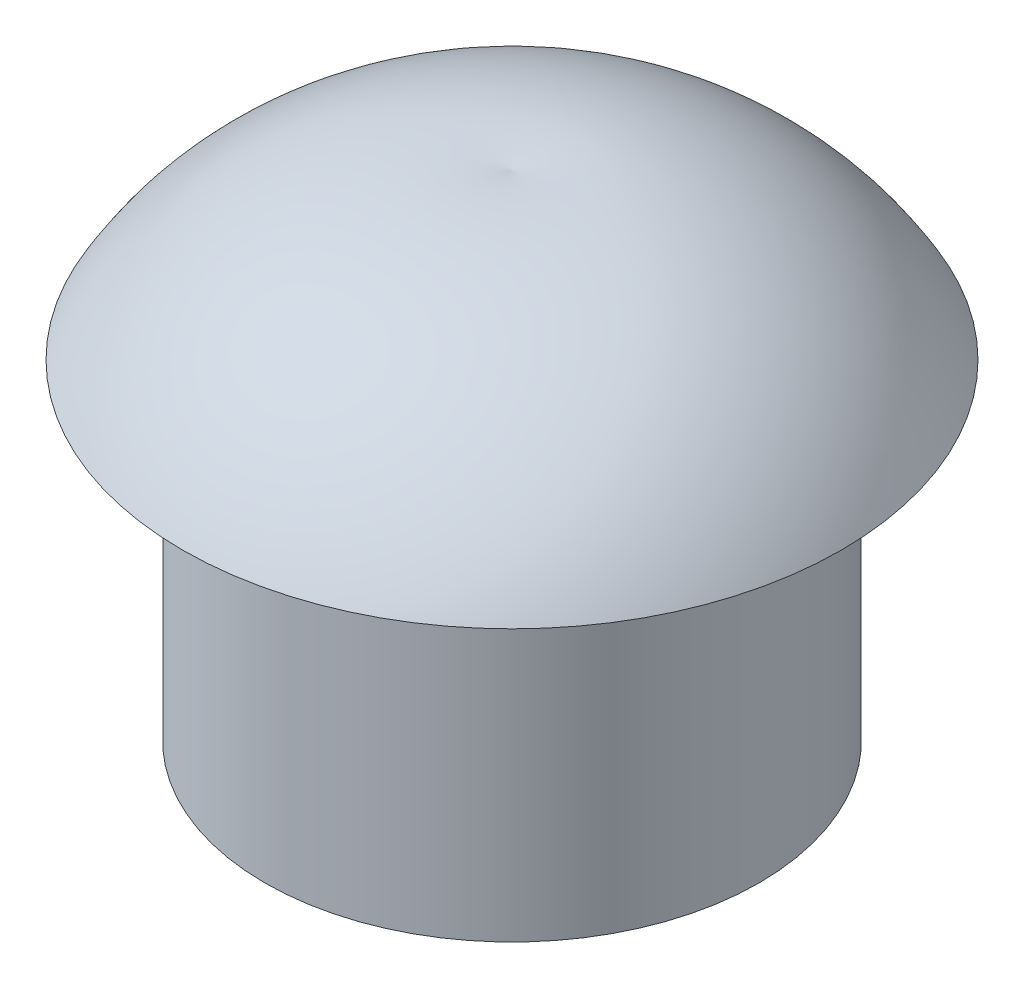
ISO-10303-21;
HEADER;
FILE_DESCRIPTION(('STEP AP214'),'2;1');
FILE_NAME('part.step','',(''),(''),'','','');
FILE_SCHEMA(('AUTOMOTIVE_DESIGN { 1 0 10303 214 1 1 1 1 }'));
ENDSEC;
DATA;
#1=APPLICATION_CONTEXT('core data for automotive mechanical design processes');
#2=APPLICATION_PROTOCOL_DEFINITION('international standard','automotive_design',2000,#1);
#3=PRODUCT_CONTEXT('',#1,'mechanical');
#4=PRODUCT('Part','Part','',(#3));
#5=PRODUCT_RELATED_PRODUCT_CATEGORY('part','',(#4));
#6=PRODUCT_DEFINITION_FORMATION('','',#4);
#7=PRODUCT_DEFINITION_CONTEXT('part definition',#1,'design');
#8=PRODUCT_DEFINITION('design','',#6,#7);
#9=PRODUCT_DEFINITION_SHAPE('','',#8);
#10=(LENGTH_UNIT() NAMED_UNIT(*) SI_UNIT(.MILLI.,.METRE.));
#11=(NAMED_UNIT(*) PLANE_ANGLE_UNIT() SI_UNIT($,.RADIAN.));
#12=(NAMED_UNIT(*) SI_UNIT($,.STERADIAN.) SOLID_ANGLE_UNIT());
#13=UNCERTAINTY_MEASURE_WITH_UNIT(LENGTH_MEASURE(1.E-05),#10,'distance_accuracy_value','');
#14=(GEOMETRIC_REPRESENTATION_CONTEXT(3) GLOBAL_UNCERTAINTY_ASSIGNED_CONTEXT((#13)) GLOBAL_UNIT_ASSIGNED_CONTEXT((#10,
#11,#12)) REPRESENTATION_CONTEXT('',''));
#15=CARTESIAN_POINT('',(0.,0.,0.));
#16=DIRECTION('',(0.,0.,1.));
#17=DIRECTION('',(1.,0.,0.));
#18=AXIS2_PLACEMENT_3D('',#15,#16,#17);
#19=CARTESIAN_POINT('',(0.,-2.,0.));
#20=DIRECTION('',(0.,1.,0.));
#21=DIRECTION('',(0.,0.,1.));
#22=AXIS2_PLACEMENT_3D('',#19,#20,#21);
#23=CYLINDRICAL_SURFACE('',#22,1.5);
#24=CARTESIAN_POINT('',(0.,-2.,0.));
#25=DIRECTION('',(0.,1.,0.));
#26=DIRECTION('',(0.,0.,1.));
#27=AXIS2_PLACEMENT_3D('',#24,#25,#26);
#28=CIRCLE('',#27,1.5);
#29=CARTESIAN_POINT('',(0.,-2.,1.5));
#30=VERTEX_POINT('',#29);
#31=EDGE_CURVE('E11',#30,#30,#28,.T.);
#32=ORIENTED_EDGE('',*,*,#31,.T.);
#33=EDGE_LOOP('',(#32));
#34=FACE_BOUND('',#33,.T.);
#35=CARTESIAN_POINT('',(0.,0.,0.));
#36=DIRECTION('',(0.,1.,0.));
#37=DIRECTION('',(0.,0.,1.));
#38=AXIS2_PLACEMENT_3D('',#35,#36,#37);
#39=CIRCLE('',#38,1.5);
#40=CARTESIAN_POINT('',(0.,0.,1.5));
#41=VERTEX_POINT('',#40);
#42=EDGE_CURVE('E42',#41,#41,#39,.T.);
#43=ORIENTED_EDGE('',*,*,#42,.F.);
#44=EDGE_LOOP('',(#43));
#45=FACE_BOUND('',#44,.T.);
#46=ADVANCED_FACE('F39',(#34,#45),#23,.T.);
#47=CARTESIAN_POINT('',(0.,-2.,0.));
#48=DIRECTION('',(0.,1.,0.));
#49=DIRECTION('',(0.,0.,1.));
#50=AXIS2_PLACEMENT_3D('',#47,#48,#49);
#51=PLANE('',#50);
#52=ORIENTED_EDGE('',*,*,#31,.F.);
#53=EDGE_LOOP('',(#52));
#54=FACE_BOUND('',#53,.T.);
#55=ADVANCED_FACE('F66',(#54),#51,.F.);
#56=CARTESIAN_POINT('',(0.,0.,0.));
#57=DIRECTION('',(0.,-1.,0.));
#58=DIRECTION('',(0.,0.,-1.));
#59=AXIS2_PLACEMENT_3D('',#56,#57,#58);
#60=PLANE('',#59);
#61=ORIENTED_EDGE('',*,*,#42,.T.);
#62=EDGE_LOOP('',(#61));
#63=FACE_BOUND('',#62,.T.);
#64=CARTESIAN_POINT('',(0.,0.,0.));
#65=DIRECTION('',(0.,-1.,0.));
#66=DIRECTION('',(0.,0.,-1.));
#67=AXIS2_PLACEMENT_3D('',#64,#65,#66);
#68=CIRCLE('',#67,2.);
#69=CARTESIAN_POINT('',(0.,0.,-2.));
#70=VERTEX_POINT('',#69);
#71=EDGE_CURVE('E57',#70,#70,#68,.T.);
#72=ORIENTED_EDGE('',*,*,#71,.T.);
#73=EDGE_LOOP('',(#72));
#74=FACE_BOUND('',#73,.T.);
#75=ADVANCED_FACE('F53',(#63,#74),#60,.T.);
#76=CARTESIAN_POINT('',(0.,-0.983239697419133,-0.258380151290434));
#77=DIRECTION('',(-1.,0.,0.));
#78=DIRECTION('',(0.,0.,-1.));
#79=AXIS2_PLACEMENT_3D('',#76,#77,#78);
#80=CIRCLE('',#79,2.);
#81=TRIMMED_CURVE('',#80,(PARAMETER_VALUE(-1.70034849394372)),
(PARAMETER_VALUE(1.70034849394372)),.T.,.PARAMETER.);
#82=CARTESIAN_POINT('',(0.,-0.983239697419133,0.));
#83=DIRECTION('',(0.,-1.,0.));
#84=AXIS1_PLACEMENT('',#82,#83);
#85=SURFACE_OF_REVOLUTION('',#81,#84);
#86=CARTESIAN_POINT('',(0.,1.,0.));
#87=VERTEX_POINT('',#86);
#88=VERTEX_LOOP('',#87);
#89=FACE_BOUND('',#88,.T.);
#90=ORIENTED_EDGE('',*,*,#71,.F.);
#91=EDGE_LOOP('',(#90));
#92=FACE_BOUND('',#91,.T.);
#93=ADVANCED_FACE('F50',(#89,#92),#85,.T.);
#94=CLOSED_SHELL('',(#46,#55,#75,#93));
#95=MANIFOLD_SOLID_BREP('B2',#94);
#96=ADVANCED_BREP_SHAPE_REPRESENTATION('',(#18,#95),#14);
#97=SHAPE_DEFINITION_REPRESENTATION(#9,#96);
ENDSEC;
END-ISO-10303-21;
